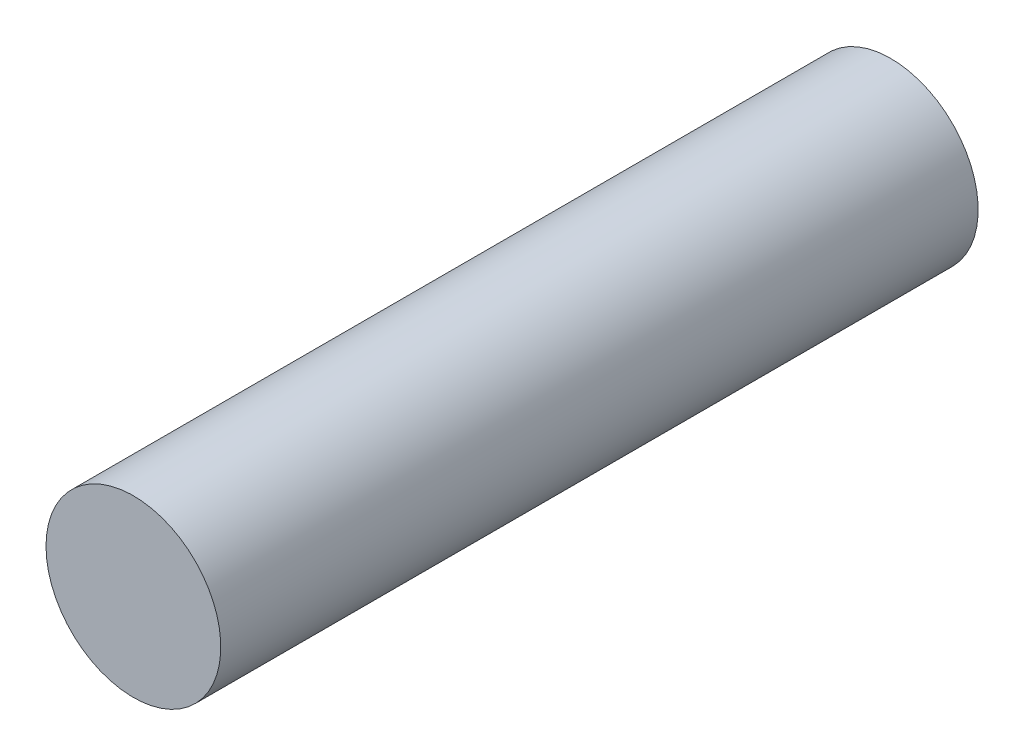
ISO-10303-21;
HEADER;
FILE_DESCRIPTION(('STEP AP214'),'2;1');
FILE_NAME('part.step','',(''),(''),'','','');
FILE_SCHEMA(('AUTOMOTIVE_DESIGN { 1 0 10303 214 1 1 1 1 }'));
ENDSEC;
DATA;
#1=APPLICATION_CONTEXT('core data for automotive mechanical design processes');
#2=APPLICATION_PROTOCOL_DEFINITION('international standard','automotive_design',2000,#1);
#3=PRODUCT_CONTEXT('',#1,'mechanical');
#4=PRODUCT('Part','Part','',(#3));
#5=PRODUCT_RELATED_PRODUCT_CATEGORY('part','',(#4));
#6=PRODUCT_DEFINITION_FORMATION('','',#4);
#7=PRODUCT_DEFINITION_CONTEXT('part definition',#1,'design');
#8=PRODUCT_DEFINITION('design','',#6,#7);
#9=PRODUCT_DEFINITION_SHAPE('','',#8);
#10=(LENGTH_UNIT() NAMED_UNIT(*) SI_UNIT(.MILLI.,.METRE.));
#11=(NAMED_UNIT(*) PLANE_ANGLE_UNIT() SI_UNIT($,.RADIAN.));
#12=(NAMED_UNIT(*) SI_UNIT($,.STERADIAN.) SOLID_ANGLE_UNIT());
#13=UNCERTAINTY_MEASURE_WITH_UNIT(LENGTH_MEASURE(1.E-05),#10,'distance_accuracy_value','');
#14=(GEOMETRIC_REPRESENTATION_CONTEXT(3) GLOBAL_UNCERTAINTY_ASSIGNED_CONTEXT((#13)) GLOBAL_UNIT_ASSIGNED_CONTEXT((#10,
#11,#12)) REPRESENTATION_CONTEXT('',''));
#15=CARTESIAN_POINT('',(0.,0.,0.));
#16=DIRECTION('',(0.,0.,1.));
#17=DIRECTION('',(1.,0.,0.));
#18=AXIS2_PLACEMENT_3D('',#15,#16,#17);
#19=CARTESIAN_POINT('',(0.,0.,6.5));
#20=DIRECTION('',(0.,0.,-1.));
#21=DIRECTION('',(-1.,0.,0.));
#22=AXIS2_PLACEMENT_3D('',#19,#20,#21);
#23=CYLINDRICAL_SURFACE('',#22,1.5);
#24=CARTESIAN_POINT('',(0.,0.,6.5));
#25=DIRECTION('',(0.,0.,1.));
#26=DIRECTION('',(1.,0.,0.));
#27=AXIS2_PLACEMENT_3D('',#24,#25,#26);
#28=CIRCLE('',#27,1.5);
#29=CARTESIAN_POINT('',(-1.5,0.,6.5));
#30=VERTEX_POINT('',#29);
#31=EDGE_CURVE('E10',#30,#30,#28,.T.);
#32=CARTESIAN_POINT('',(0.,0.,-6.5));
#33=DIRECTION('',(0.,0.,1.));
#34=DIRECTION('',(1.,0.,0.));
#35=AXIS2_PLACEMENT_3D('',#32,#33,#34);
#36=CIRCLE('',#35,1.5);
#37=CARTESIAN_POINT('',(-1.5,0.,-6.5));
#38=VERTEX_POINT('',#37);
#39=EDGE_CURVE('E36',#38,#38,#36,.T.);
#40=CARTESIAN_POINT('',(-1.5,0.,6.5));
#41=CARTESIAN_POINT('',(-1.5,0.,6.36458333333333));
#42=CARTESIAN_POINT('',(-1.5,0.,6.22916666666667));
#43=CARTESIAN_POINT('',(-1.5,0.,5.95833333333333));
#44=CARTESIAN_POINT('',(-1.5,0.,5.82291666666667));
#45=CARTESIAN_POINT('',(-1.5,0.,5.55208333333333));
#46=CARTESIAN_POINT('',(-1.5,0.,5.41666666666667));
#47=CARTESIAN_POINT('',(-1.5,0.,5.14583333333333));
#48=CARTESIAN_POINT('',(-1.5,0.,5.01041666666667));
#49=CARTESIAN_POINT('',(-1.5,0.,4.73958333333333));
#50=CARTESIAN_POINT('',(-1.5,0.,4.60416666666667));
#51=CARTESIAN_POINT('',(-1.5,0.,4.33333333333333));
#52=CARTESIAN_POINT('',(-1.5,0.,4.19791666666667));
#53=CARTESIAN_POINT('',(-1.5,0.,3.92708333333333));
#54=CARTESIAN_POINT('',(-1.5,0.,3.79166666666667));
#55=CARTESIAN_POINT('',(-1.5,0.,3.52083333333333));
#56=CARTESIAN_POINT('',(-1.5,0.,3.38541666666667));
#57=CARTESIAN_POINT('',(-1.5,0.,3.11458333333333));
#58=CARTESIAN_POINT('',(-1.5,0.,2.97916666666667));
#59=CARTESIAN_POINT('',(-1.5,0.,2.70833333333333));
#60=CARTESIAN_POINT('',(-1.5,0.,2.57291666666667));
#61=CARTESIAN_POINT('',(-1.5,0.,2.30208333333333));
#62=CARTESIAN_POINT('',(-1.5,0.,2.16666666666667));
#63=CARTESIAN_POINT('',(-1.5,0.,1.89583333333333));
#64=CARTESIAN_POINT('',(-1.5,0.,1.76041666666667));
#65=CARTESIAN_POINT('',(-1.5,0.,1.48958333333333));
#66=CARTESIAN_POINT('',(-1.5,0.,1.35416666666667));
#67=CARTESIAN_POINT('',(-1.5,0.,1.08333333333333));
#68=CARTESIAN_POINT('',(-1.5,0.,0.947916666666666));
#69=CARTESIAN_POINT('',(-1.5,0.,0.677083333333332));
#70=CARTESIAN_POINT('',(-1.5,0.,0.541666666666666));
#71=CARTESIAN_POINT('',(-1.5,0.,0.270833333333333));
#72=CARTESIAN_POINT('',(-1.5,0.,0.135416666666666));
#73=CARTESIAN_POINT('',(-1.5,0.,-0.135416666666668));
#74=CARTESIAN_POINT('',(-1.5,0.,-0.270833333333334));
#75=CARTESIAN_POINT('',(-1.5,0.,-0.541666666666668));
#76=CARTESIAN_POINT('',(-1.5,0.,-0.677083333333334));
#77=CARTESIAN_POINT('',(-1.5,0.,-0.947916666666667));
#78=CARTESIAN_POINT('',(-1.5,0.,-1.08333333333333));
#79=CARTESIAN_POINT('',(-1.5,0.,-1.35416666666667));
#80=CARTESIAN_POINT('',(-1.5,0.,-1.48958333333333));
#81=CARTESIAN_POINT('',(-1.5,0.,-1.76041666666667));
#82=CARTESIAN_POINT('',(-1.5,0.,-1.89583333333333));
#83=CARTESIAN_POINT('',(-1.5,0.,-2.16666666666667));
#84=CARTESIAN_POINT('',(-1.5,0.,-2.30208333333333));
#85=CARTESIAN_POINT('',(-1.5,0.,-2.57291666666667));
#86=CARTESIAN_POINT('',(-1.5,0.,-2.70833333333333));
#87=CARTESIAN_POINT('',(-1.5,0.,-2.97916666666667));
#88=CARTESIAN_POINT('',(-1.5,0.,-3.11458333333333));
#89=CARTESIAN_POINT('',(-1.5,0.,-3.38541666666667));
#90=CARTESIAN_POINT('',(-1.5,0.,-3.52083333333333));
#91=CARTESIAN_POINT('',(-1.5,0.,-3.79166666666667));
#92=CARTESIAN_POINT('',(-1.5,0.,-3.92708333333333));
#93=CARTESIAN_POINT('',(-1.5,0.,-4.19791666666667));
#94=CARTESIAN_POINT('',(-1.5,0.,-4.33333333333333));
#95=CARTESIAN_POINT('',(-1.5,0.,-4.60416666666667));
#96=CARTESIAN_POINT('',(-1.5,0.,-4.73958333333333));
#97=CARTESIAN_POINT('',(-1.5,0.,-5.01041666666667));
#98=CARTESIAN_POINT('',(-1.5,0.,-5.14583333333333));
#99=CARTESIAN_POINT('',(-1.5,0.,-5.41666666666667));
#100=CARTESIAN_POINT('',(-1.5,0.,-5.55208333333333));
#101=CARTESIAN_POINT('',(-1.5,0.,-5.82291666666667));
#102=CARTESIAN_POINT('',(-1.5,0.,-5.95833333333333));
#103=CARTESIAN_POINT('',(-1.5,0.,-6.22916666666667));
#104=CARTESIAN_POINT('',(-1.5,0.,-6.36458333333333));
#105=CARTESIAN_POINT('',(-1.5,0.,-6.5));
#106=B_SPLINE_CURVE_WITH_KNOTS('',3,(#40,#41,#42,#43,#44,#45,#46,#47,#48,#49,#50,#51,#52,#53,
#54,#55,#56,#57,#58,#59,#60,#61,#62,#63,#64,#65,#66,#67,#68,#69,#70,#71,#72,#73,#74,#75,#76,#77,
#78,#79,#80,#81,#82,#83,#84,#85,#86,#87,#88,#89,#90,#91,#92,#93,#94,#95,#96,#97,#98,#99,#100,
#101,#102,#103,#104,#105),.UNSPECIFIED.,.F.,.F.,(4,2,2,2,2,2,2,2,2,2,2,2,2,2,2,2,2,2,2,2,2,2,2,
2,2,2,2,2,2,2,2,2,4),(0.,0.40625,0.8125,1.21875,1.625,2.03125,2.4375,2.84375,3.25,3.65625,
4.0625,4.46875,4.875,5.28125,5.6875,6.09375,6.5,6.90625,7.3125,7.71875,8.125,8.53125,8.9375,
9.34375,9.75,10.15625,10.5625,10.96875,11.375,11.78125,12.1875,12.59375,13.),.UNSPECIFIED.);
#107=EDGE_CURVE('BSEAM33',#30,#38,#106,.T.);
#108=ORIENTED_EDGE('',*,*,#31,.F.);
#109=ORIENTED_EDGE('',*,*,#39,.T.);
#110=ORIENTED_EDGE('',*,*,#107,.T.);
#111=ORIENTED_EDGE('',*,*,#107,.F.);
#112=EDGE_LOOP('',(#108,#110,#109,#111));
#113=FACE_BOUND('',#112,.T.);
#114=ADVANCED_FACE('F33',(#113),#23,.T.);
#115=CARTESIAN_POINT('',(0.,0.,6.5));
#116=DIRECTION('',(0.,0.,1.));
#117=DIRECTION('',(1.,0.,0.));
#118=AXIS2_PLACEMENT_3D('',#115,#116,#117);
#119=PLANE('',#118);
#120=ORIENTED_EDGE('',*,*,#31,.T.);
#121=EDGE_LOOP('',(#120));
#122=FACE_BOUND('',#121,.T.);
#123=ADVANCED_FACE('F48',(#122),#119,.T.);
#124=CARTESIAN_POINT('',(0.,0.,-6.5));
#125=DIRECTION('',(0.,0.,1.));
#126=DIRECTION('',(1.,0.,0.));
#127=AXIS2_PLACEMENT_3D('',#124,#125,#126);
#128=PLANE('',#127);
#129=ORIENTED_EDGE('',*,*,#39,.F.);
#130=EDGE_LOOP('',(#129));
#131=FACE_BOUND('',#130,.T.);
#132=ADVANCED_FACE('F46',(#131),#128,.F.);
#133=CLOSED_SHELL('',(#114,#123,#132));
#134=MANIFOLD_SOLID_BREP('B2',#133);
#135=ADVANCED_BREP_SHAPE_REPRESENTATION('',(#18,#134),#14);
#136=SHAPE_DEFINITION_REPRESENTATION(#9,#135);
ENDSEC;
END-ISO-10303-21;
